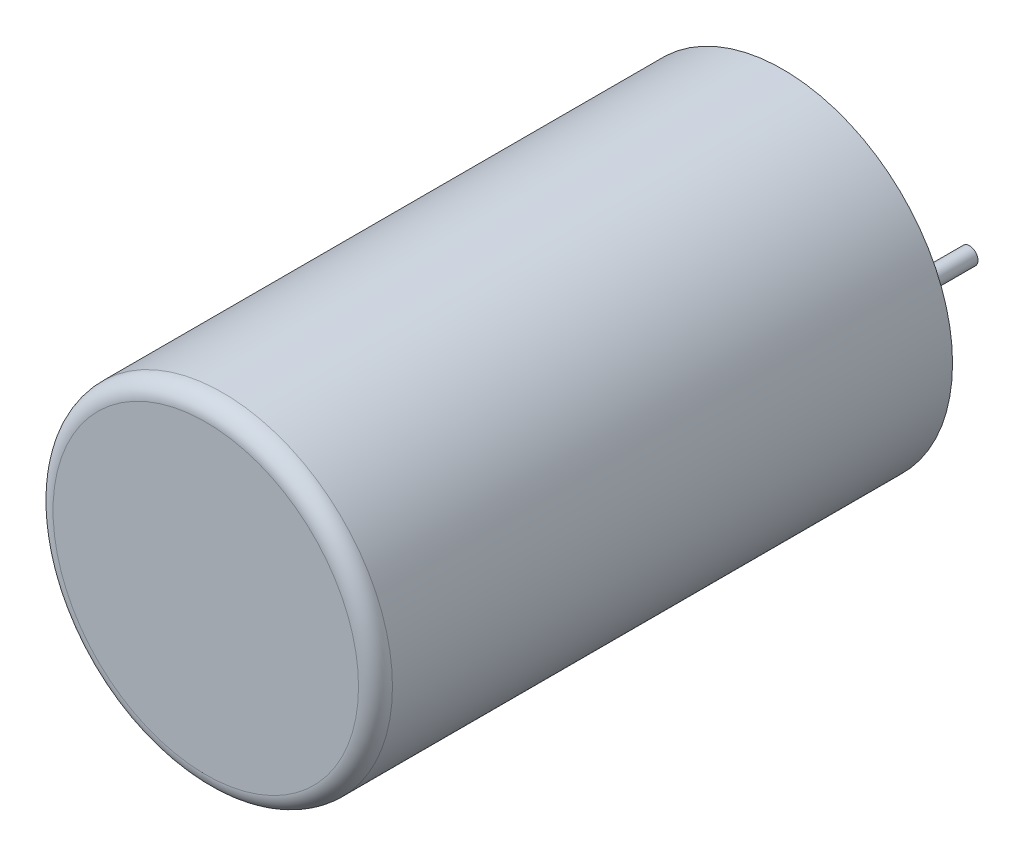
ISO-10303-21;
HEADER;
FILE_DESCRIPTION(('STEP AP214'),'2;1');
FILE_NAME('part.step','',(''),(''),'','','');
FILE_SCHEMA(('AUTOMOTIVE_DESIGN { 1 0 10303 214 1 1 1 1 }'));
ENDSEC;
DATA;
#1=APPLICATION_CONTEXT('core data for automotive mechanical design processes');
#2=APPLICATION_PROTOCOL_DEFINITION('international standard','automotive_design',2000,#1);
#3=PRODUCT_CONTEXT('',#1,'mechanical');
#4=PRODUCT('Part','Part','',(#3));
#5=PRODUCT_RELATED_PRODUCT_CATEGORY('part','',(#4));
#6=PRODUCT_DEFINITION_FORMATION('','',#4);
#7=PRODUCT_DEFINITION_CONTEXT('part definition',#1,'design');
#8=PRODUCT_DEFINITION('design','',#6,#7);
#9=PRODUCT_DEFINITION_SHAPE('','',#8);
#10=(LENGTH_UNIT() NAMED_UNIT(*) SI_UNIT(.MILLI.,.METRE.));
#11=(NAMED_UNIT(*) PLANE_ANGLE_UNIT() SI_UNIT($,.RADIAN.));
#12=(NAMED_UNIT(*) SI_UNIT($,.STERADIAN.) SOLID_ANGLE_UNIT());
#13=UNCERTAINTY_MEASURE_WITH_UNIT(LENGTH_MEASURE(1.E-05),#10,'distance_accuracy_value','');
#14=(GEOMETRIC_REPRESENTATION_CONTEXT(3) GLOBAL_UNCERTAINTY_ASSIGNED_CONTEXT((#13)) GLOBAL_UNIT_ASSIGNED_CONTEXT((#10,
#11,#12)) REPRESENTATION_CONTEXT('',''));
#15=CARTESIAN_POINT('',(0.,0.,0.));
#16=DIRECTION('',(0.,0.,1.));
#17=DIRECTION('',(1.,0.,0.));
#18=AXIS2_PLACEMENT_3D('',#15,#16,#17);
#19=CARTESIAN_POINT('',(0.,0.,0.));
#20=DIRECTION('',(0.,0.,1.));
#21=DIRECTION('',(1.,0.,0.));
#22=AXIS2_PLACEMENT_3D('',#19,#20,#21);
#23=PLANE('',#22);
#24=CARTESIAN_POINT('',(2.5,0.,0.));
#25=DIRECTION('',(0.,0.,1.));
#26=DIRECTION('',(1.,0.,0.));
#27=AXIS2_PLACEMENT_3D('',#24,#25,#26);
#28=CIRCLE('',#27,0.25);
#29=CARTESIAN_POINT('',(2.75,0.,0.));
#30=VERTEX_POINT('',#29);
#31=EDGE_CURVE('E44',#30,#30,#28,.F.);
#32=ORIENTED_EDGE('',*,*,#31,.F.);
#33=EDGE_LOOP('',(#32));
#34=FACE_BOUND('',#33,.T.);
#35=CARTESIAN_POINT('',(0.,0.,0.));
#36=DIRECTION('',(0.,0.,1.));
#37=DIRECTION('',(1.,0.,0.));
#38=AXIS2_PLACEMENT_3D('',#35,#36,#37);
#39=CIRCLE('',#38,5.);
#40=CARTESIAN_POINT('',(5.,0.,0.));
#41=VERTEX_POINT('',#40);
#42=EDGE_CURVE('E49',#41,#41,#39,.T.);
#43=ORIENTED_EDGE('',*,*,#42,.F.);
#44=EDGE_LOOP('',(#43));
#45=FACE_BOUND('',#44,.T.);
#46=CARTESIAN_POINT('',(-2.5,0.,0.));
#47=DIRECTION('',(0.,0.,1.));
#48=DIRECTION('',(1.,0.,0.));
#49=AXIS2_PLACEMENT_3D('',#46,#47,#48);
#50=CIRCLE('',#49,0.25);
#51=CARTESIAN_POINT('',(-2.25,0.,0.));
#52=VERTEX_POINT('',#51);
#53=EDGE_CURVE('E40',#52,#52,#50,.F.);
#54=ORIENTED_EDGE('',*,*,#53,.F.);
#55=EDGE_LOOP('',(#54));
#56=FACE_BOUND('',#55,.T.);
#57=ADVANCED_FACE('F29',(#34,#45,#56),#23,.F.);
#58=CARTESIAN_POINT('',(0.,0.,17.));
#59=DIRECTION('',(0.,0.,-1.));
#60=DIRECTION('',(-1.,0.,0.));
#61=AXIS2_PLACEMENT_3D('',#58,#59,#60);
#62=CYLINDRICAL_SURFACE('',#61,5.);
#63=CARTESIAN_POINT('',(0.,0.,16.5));
#64=DIRECTION('',(0.,0.,1.));
#65=DIRECTION('',(1.,0.,0.));
#66=AXIS2_PLACEMENT_3D('',#63,#64,#65);
#67=CIRCLE('',#66,5.);
#68=CARTESIAN_POINT('',(5.,0.,16.5));
#69=VERTEX_POINT('',#68);
#70=EDGE_CURVE('E10',#69,#69,#67,.F.);
#71=ORIENTED_EDGE('',*,*,#70,.T.);
#72=EDGE_LOOP('',(#71));
#73=FACE_BOUND('',#72,.T.);
#74=ORIENTED_EDGE('',*,*,#42,.T.);
#75=EDGE_LOOP('',(#74));
#76=FACE_BOUND('',#75,.T.);
#77=ADVANCED_FACE('F69',(#73,#76),#62,.T.);
#78=CARTESIAN_POINT('',(0.,0.,17.));
#79=DIRECTION('',(0.,0.,1.));
#80=DIRECTION('',(1.,0.,0.));
#81=AXIS2_PLACEMENT_3D('',#78,#79,#80);
#82=PLANE('',#81);
#83=CARTESIAN_POINT('',(0.,0.,17.));
#84=DIRECTION('',(0.,0.,1.));
#85=DIRECTION('',(1.,0.,0.));
#86=AXIS2_PLACEMENT_3D('',#83,#84,#85);
#87=CIRCLE('',#86,4.5);
#88=CARTESIAN_POINT('',(4.5,0.,17.));
#89=VERTEX_POINT('',#88);
#90=EDGE_CURVE('E36',#89,#89,#87,.T.);
#91=ORIENTED_EDGE('',*,*,#90,.T.);
#92=EDGE_LOOP('',(#91));
#93=FACE_BOUND('',#92,.T.);
#94=ADVANCED_FACE('F75',(#93),#82,.T.);
#95=CARTESIAN_POINT('',(2.5,0.,-3.));
#96=DIRECTION('',(0.,0.,1.));
#97=DIRECTION('',(1.,0.,0.));
#98=AXIS2_PLACEMENT_3D('',#95,#96,#97);
#99=CYLINDRICAL_SURFACE('',#98,0.25);
#100=CARTESIAN_POINT('',(2.5,0.,-3.));
#101=DIRECTION('',(0.,0.,-1.));
#102=DIRECTION('',(-1.,0.,0.));
#103=AXIS2_PLACEMENT_3D('',#100,#101,#102);
#104=CIRCLE('',#103,0.25);
#105=CARTESIAN_POINT('',(2.25,0.,-3.));
#106=VERTEX_POINT('',#105);
#107=EDGE_CURVE('E52',#106,#106,#104,.T.);
#108=ORIENTED_EDGE('',*,*,#107,.F.);
#109=EDGE_LOOP('',(#108));
#110=FACE_BOUND('',#109,.T.);
#111=ORIENTED_EDGE('',*,*,#31,.T.);
#112=EDGE_LOOP('',(#111));
#113=FACE_BOUND('',#112,.T.);
#114=ADVANCED_FACE('F81',(#110,#113),#99,.T.);
#115=CARTESIAN_POINT('',(2.5,0.,-3.));
#116=DIRECTION('',(0.,0.,-1.));
#117=DIRECTION('',(-1.,0.,0.));
#118=AXIS2_PLACEMENT_3D('',#115,#116,#117);
#119=PLANE('',#118);
#120=ORIENTED_EDGE('',*,*,#107,.T.);
#121=EDGE_LOOP('',(#120));
#122=FACE_BOUND('',#121,.T.);
#123=ADVANCED_FACE('F64',(#122),#119,.T.);
#124=CARTESIAN_POINT('',(-2.5,0.,-3.));
#125=DIRECTION('',(0.,0.,1.));
#126=DIRECTION('',(1.,0.,0.));
#127=AXIS2_PLACEMENT_3D('',#124,#125,#126);
#128=CYLINDRICAL_SURFACE('',#127,0.25);
#129=CARTESIAN_POINT('',(-2.5,0.,-3.));
#130=DIRECTION('',(0.,0.,-1.));
#131=DIRECTION('',(-1.,0.,0.));
#132=AXIS2_PLACEMENT_3D('',#129,#130,#131);
#133=CIRCLE('',#132,0.25);
#134=CARTESIAN_POINT('',(-2.75,0.,-3.));
#135=VERTEX_POINT('',#134);
#136=EDGE_CURVE('E55',#135,#135,#133,.T.);
#137=ORIENTED_EDGE('',*,*,#136,.F.);
#138=EDGE_LOOP('',(#137));
#139=FACE_BOUND('',#138,.T.);
#140=ORIENTED_EDGE('',*,*,#53,.T.);
#141=EDGE_LOOP('',(#140));
#142=FACE_BOUND('',#141,.T.);
#143=ADVANCED_FACE('F61',(#139,#142),#128,.T.);
#144=CARTESIAN_POINT('',(-2.5,0.,-3.));
#145=DIRECTION('',(0.,0.,-1.));
#146=DIRECTION('',(-1.,0.,0.));
#147=AXIS2_PLACEMENT_3D('',#144,#145,#146);
#148=PLANE('',#147);
#149=ORIENTED_EDGE('',*,*,#136,.T.);
#150=EDGE_LOOP('',(#149));
#151=FACE_BOUND('',#150,.T.);
#152=ADVANCED_FACE('F59',(#151),#148,.T.);
#153=CARTESIAN_POINT('',(0.,0.,16.5));
#154=DIRECTION('',(0.,0.,1.));
#155=DIRECTION('',(1.,0.,0.));
#156=AXIS2_PLACEMENT_3D('',#153,#154,#155);
#157=TOROIDAL_SURFACE('',#156,4.5,0.5);
#158=ORIENTED_EDGE('',*,*,#70,.F.);
#159=EDGE_LOOP('',(#158));
#160=FACE_BOUND('',#159,.T.);
#161=ORIENTED_EDGE('',*,*,#90,.F.);
#162=EDGE_LOOP('',(#161));
#163=FACE_BOUND('',#162,.T.);
#164=ADVANCED_FACE('F31',(#160,#163),#157,.T.);
#165=CLOSED_SHELL('',(#57,#77,#94,#114,#123,#143,#152,#164));
#166=MANIFOLD_SOLID_BREP('B2',#165);
#167=ADVANCED_BREP_SHAPE_REPRESENTATION('',(#18,#166),#14);
#168=SHAPE_DEFINITION_REPRESENTATION(#9,#167);
ENDSEC;
END-ISO-10303-21;
